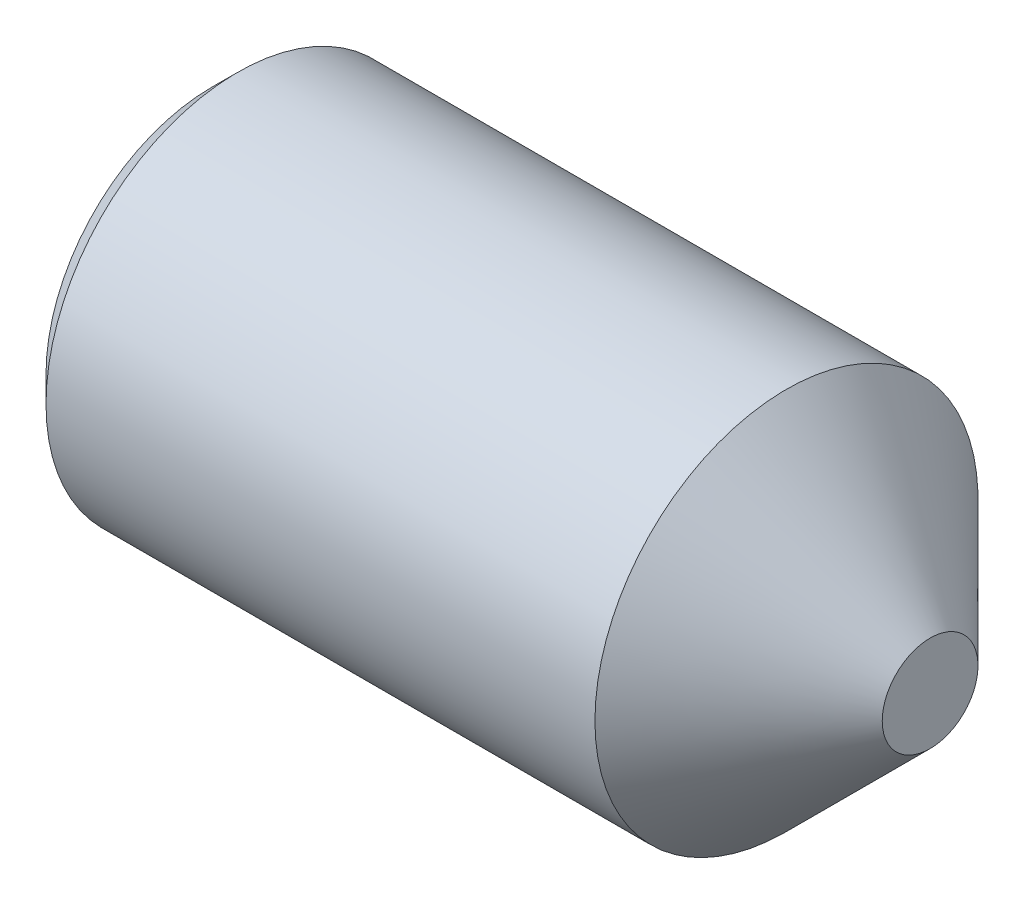
ISO-10303-21;
HEADER;
FILE_DESCRIPTION(('STEP AP214'),'2;1');
FILE_NAME('part.step','',(''),(''),'','','');
FILE_SCHEMA(('AUTOMOTIVE_DESIGN { 1 0 10303 214 1 1 1 1 }'));
ENDSEC;
DATA;
#1=APPLICATION_CONTEXT('core data for automotive mechanical design processes');
#2=APPLICATION_PROTOCOL_DEFINITION('international standard','automotive_design',2000,#1);
#3=PRODUCT_CONTEXT('',#1,'mechanical');
#4=PRODUCT('Part','Part','',(#3));
#5=PRODUCT_RELATED_PRODUCT_CATEGORY('part','',(#4));
#6=PRODUCT_DEFINITION_FORMATION('','',#4);
#7=PRODUCT_DEFINITION_CONTEXT('part definition',#1,'design');
#8=PRODUCT_DEFINITION('design','',#6,#7);
#9=PRODUCT_DEFINITION_SHAPE('','',#8);
#10=(LENGTH_UNIT() NAMED_UNIT(*) SI_UNIT(.MILLI.,.METRE.));
#11=(NAMED_UNIT(*) PLANE_ANGLE_UNIT() SI_UNIT($,.RADIAN.));
#12=(NAMED_UNIT(*) SI_UNIT($,.STERADIAN.) SOLID_ANGLE_UNIT());
#13=UNCERTAINTY_MEASURE_WITH_UNIT(LENGTH_MEASURE(1.E-05),#10,'distance_accuracy_value','');
#14=(GEOMETRIC_REPRESENTATION_CONTEXT(3) GLOBAL_UNCERTAINTY_ASSIGNED_CONTEXT((#13)) GLOBAL_UNIT_ASSIGNED_CONTEXT((#10,
#11,#12)) REPRESENTATION_CONTEXT('',''));
#15=CARTESIAN_POINT('',(0.,0.,0.));
#16=DIRECTION('',(0.,0.,1.));
#17=DIRECTION('',(1.,0.,0.));
#18=AXIS2_PLACEMENT_3D('',#15,#16,#17);
#19=CARTESIAN_POINT('',(10.,0.,4.5745));
#20=DIRECTION('',(-1.,0.,0.));
#21=DIRECTION('',(0.,0.,1.));
#22=AXIS2_PLACEMENT_3D('',#19,#20,#21);
#23=PLANE('',#22);
#24=CARTESIAN_POINT('',(10.,0.,0.));
#25=DIRECTION('',(-1.,0.,0.));
#26=DIRECTION('',(0.,0.,1.));
#27=AXIS2_PLACEMENT_3D('',#24,#25,#26);
#28=CIRCLE('',#27,3.96163320961192);
#29=CARTESIAN_POINT('',(10.,1.98081660480596,3.430875));
#30=VERTEX_POINT('',#29);
#31=CARTESIAN_POINT('',(10.,3.96163320961192,0.));
#32=VERTEX_POINT('',#31);
#33=EDGE_CURVE('E51',#30,#32,#28,.T.);
#34=ORIENTED_EDGE('',*,*,#33,.F.);
#35=DIRECTION('',(0.,0.866025403784439,-0.5));
#36=VECTOR('',#35,1.);
#37=CARTESIAN_POINT('',(10.,0.,4.5745));
#38=LINE('',#37,#36);
#39=CARTESIAN_POINT('',(10.,3.96163320961192,2.28725));
#40=VERTEX_POINT('',#39);
#41=EDGE_CURVE('E240',#30,#40,#38,.T.);
#42=ORIENTED_EDGE('',*,*,#41,.T.);
#43=DIRECTION('',(0.,0.,-1.));
#44=VECTOR('',#43,1.);
#45=CARTESIAN_POINT('',(10.,3.96163320961192,2.28725));
#46=LINE('',#45,#44);
#47=EDGE_CURVE('E233',#40,#32,#46,.T.);
#48=ORIENTED_EDGE('',*,*,#47,.T.);
#49=EDGE_LOOP('',(#34,#42,#48));
#50=FACE_BOUND('',#49,.T.);
#51=ADVANCED_FACE('F40',(#50),#23,.T.);
#52=CARTESIAN_POINT('',(10.,1.98081660480596,-3.430875));
#53=VERTEX_POINT('',#52);
#54=EDGE_CURVE('E11',#32,#53,#28,.T.);
#55=ORIENTED_EDGE('',*,*,#54,.F.);
#56=CARTESIAN_POINT('',(10.,3.96163320961192,-2.28725));
#57=VERTEX_POINT('',#56);
#58=EDGE_CURVE('E236',#32,#57,#46,.T.);
#59=ORIENTED_EDGE('',*,*,#58,.T.);
#60=DIRECTION('',(0.,-0.866025403784439,-0.5));
#61=VECTOR('',#60,1.);
#62=CARTESIAN_POINT('',(10.,3.96163320961192,-2.28725));
#63=LINE('',#62,#61);
#64=EDGE_CURVE('E229',#57,#53,#63,.T.);
#65=ORIENTED_EDGE('',*,*,#64,.T.);
#66=EDGE_LOOP('',(#55,#59,#65));
#67=FACE_BOUND('',#66,.T.);
#68=ADVANCED_FACE('F127',(#67),#23,.T.);
#69=CARTESIAN_POINT('',(10.,-1.98081660480596,-3.430875));
#70=VERTEX_POINT('',#69);
#71=EDGE_CURVE('E49',#53,#70,#28,.T.);
#72=ORIENTED_EDGE('',*,*,#71,.F.);
#73=CARTESIAN_POINT('',(10.,0.,-4.5745));
#74=VERTEX_POINT('',#73);
#75=EDGE_CURVE('E232',#53,#74,#63,.T.);
#76=ORIENTED_EDGE('',*,*,#75,.T.);
#77=DIRECTION('',(0.,-0.866025403784439,0.5));
#78=VECTOR('',#77,1.);
#79=CARTESIAN_POINT('',(10.,0.,-4.5745));
#80=LINE('',#79,#78);
#81=EDGE_CURVE('E225',#74,#70,#80,.T.);
#82=ORIENTED_EDGE('',*,*,#81,.T.);
#83=EDGE_LOOP('',(#72,#76,#82));
#84=FACE_BOUND('',#83,.T.);
#85=ADVANCED_FACE('F132',(#84),#23,.T.);
#86=CARTESIAN_POINT('',(10.,-3.96163320961192,0.));
#87=VERTEX_POINT('',#86);
#88=EDGE_CURVE('E244',#70,#87,#28,.T.);
#89=ORIENTED_EDGE('',*,*,#88,.F.);
#90=CARTESIAN_POINT('',(10.,-3.96163320961191,-2.28725));
#91=VERTEX_POINT('',#90);
#92=EDGE_CURVE('E228',#70,#91,#80,.T.);
#93=ORIENTED_EDGE('',*,*,#92,.T.);
#94=DIRECTION('',(0.,0.,1.));
#95=VECTOR('',#94,1.);
#96=CARTESIAN_POINT('',(10.,-3.96163320961191,-2.28725));
#97=LINE('',#96,#95);
#98=EDGE_CURVE('E196',#91,#87,#97,.T.);
#99=ORIENTED_EDGE('',*,*,#98,.T.);
#100=EDGE_LOOP('',(#89,#93,#99));
#101=FACE_BOUND('',#100,.T.);
#102=ADVANCED_FACE('F251',(#101),#23,.T.);
#103=CARTESIAN_POINT('',(10.,-1.98081660480596,3.430875));
#104=VERTEX_POINT('',#103);
#105=EDGE_CURVE('E58',#87,#104,#28,.T.);
#106=ORIENTED_EDGE('',*,*,#105,.F.);
#107=CARTESIAN_POINT('',(10.,-3.96163320961192,2.28725));
#108=VERTEX_POINT('',#107);
#109=EDGE_CURVE('E224',#87,#108,#97,.T.);
#110=ORIENTED_EDGE('',*,*,#109,.T.);
#111=DIRECTION('',(0.,0.866025403784439,0.5));
#112=VECTOR('',#111,1.);
#113=CARTESIAN_POINT('',(10.,-3.96163320961192,2.28725));
#114=LINE('',#113,#112);
#115=EDGE_CURVE('E241',#108,#104,#114,.T.);
#116=ORIENTED_EDGE('',*,*,#115,.T.);
#117=EDGE_LOOP('',(#106,#110,#116));
#118=FACE_BOUND('',#117,.T.);
#119=ADVANCED_FACE('F125',(#118),#23,.T.);
#120=CARTESIAN_POINT('',(0.,6.928,0.));
#121=DIRECTION('',(1.,0.,0.));
#122=DIRECTION('',(0.,0.,-1.));
#123=AXIS2_PLACEMENT_3D('',#120,#121,#122);
#124=PLANE('',#123);
#125=DIRECTION('',(0.,0.866025403784439,-0.5));
#126=VECTOR('',#125,1.);
#127=CARTESIAN_POINT('',(0.,0.,4.5745));
#128=LINE('',#127,#126);
#129=CARTESIAN_POINT('',(0.,0.,4.5745));
#130=VERTEX_POINT('',#129);
#131=CARTESIAN_POINT('',(0.,3.96163320961192,2.28725));
#132=VERTEX_POINT('',#131);
#133=EDGE_CURVE('E218',#130,#132,#128,.T.);
#134=ORIENTED_EDGE('',*,*,#133,.F.);
#135=DIRECTION('',(0.,0.866025403784439,0.5));
#136=VECTOR('',#135,1.);
#137=CARTESIAN_POINT('',(0.,-3.96163320961192,2.28725));
#138=LINE('',#137,#136);
#139=CARTESIAN_POINT('',(0.,-3.96163320961192,2.28725));
#140=VERTEX_POINT('',#139);
#141=EDGE_CURVE('E66',#140,#130,#138,.T.);
#142=ORIENTED_EDGE('',*,*,#141,.F.);
#143=DIRECTION('',(0.,0.,1.));
#144=VECTOR('',#143,1.);
#145=CARTESIAN_POINT('',(0.,-3.96163320961191,-2.28725));
#146=LINE('',#145,#144);
#147=CARTESIAN_POINT('',(0.,-3.96163320961191,-2.28725));
#148=VERTEX_POINT('',#147);
#149=EDGE_CURVE('E205',#148,#140,#146,.T.);
#150=ORIENTED_EDGE('',*,*,#149,.F.);
#151=DIRECTION('',(0.,-0.866025403784439,0.5));
#152=VECTOR('',#151,1.);
#153=CARTESIAN_POINT('',(0.,0.,-4.5745));
#154=LINE('',#153,#152);
#155=CARTESIAN_POINT('',(0.,0.,-4.5745));
#156=VERTEX_POINT('',#155);
#157=EDGE_CURVE('E209',#156,#148,#154,.T.);
#158=ORIENTED_EDGE('',*,*,#157,.F.);
#159=DIRECTION('',(0.,-0.866025403784439,-0.5));
#160=VECTOR('',#159,1.);
#161=CARTESIAN_POINT('',(0.,3.96163320961192,-2.28725));
#162=LINE('',#161,#160);
#163=CARTESIAN_POINT('',(0.,3.96163320961192,-2.28725));
#164=VERTEX_POINT('',#163);
#165=EDGE_CURVE('E212',#164,#156,#162,.T.);
#166=ORIENTED_EDGE('',*,*,#165,.F.);
#167=DIRECTION('',(0.,0.,-1.));
#168=VECTOR('',#167,1.);
#169=CARTESIAN_POINT('',(0.,3.96163320961192,2.28725));
#170=LINE('',#169,#168);
#171=EDGE_CURVE('E215',#132,#164,#170,.T.);
#172=ORIENTED_EDGE('',*,*,#171,.F.);
#173=EDGE_LOOP('',(#134,#142,#150,#158,#166,#172));
#174=FACE_BOUND('',#173,.T.);
#175=CARTESIAN_POINT('',(0.,0.,0.));
#176=DIRECTION('',(-1.,0.,0.));
#177=DIRECTION('',(0.,0.,1.));
#178=AXIS2_PLACEMENT_3D('',#175,#176,#177);
#179=CIRCLE('',#178,6.928);
#180=CARTESIAN_POINT('',(0.,0.,6.928));
#181=VERTEX_POINT('',#180);
#182=EDGE_CURVE('E44',#181,#181,#179,.T.);
#183=ORIENTED_EDGE('',*,*,#182,.T.);
#184=EDGE_LOOP('',(#183));
#185=FACE_BOUND('',#184,.T.);
#186=ADVANCED_FACE('F42',(#174,#185),#124,.F.);
#187=CARTESIAN_POINT('',(1.07200000000001,0.,0.));
#188=DIRECTION('',(1.,0.,0.));
#189=DIRECTION('',(0.,0.,-1.));
#190=AXIS2_PLACEMENT_3D('',#187,#188,#189);
#191=CONICAL_SURFACE('',#190,8.,0.785398163397443);
#192=ORIENTED_EDGE('',*,*,#182,.F.);
#193=EDGE_LOOP('',(#192));
#194=FACE_BOUND('',#193,.T.);
#195=CARTESIAN_POINT('',(1.07200000000001,0.,0.));
#196=DIRECTION('',(-1.,0.,0.));
#197=DIRECTION('',(0.,0.,1.));
#198=AXIS2_PLACEMENT_3D('',#195,#196,#197);
#199=CIRCLE('',#198,8.);
#200=CARTESIAN_POINT('',(1.07200000000001,0.,8.));
#201=VERTEX_POINT('',#200);
#202=EDGE_CURVE('E181',#201,#201,#199,.T.);
#203=ORIENTED_EDGE('',*,*,#202,.T.);
#204=EDGE_LOOP('',(#203));
#205=FACE_BOUND('',#204,.T.);
#206=ADVANCED_FACE('F168',(#194,#205),#191,.T.);
#207=CARTESIAN_POINT('',(-1.4104518001455,0.,0.));
#208=DIRECTION('',(-1.,0.,0.));
#209=DIRECTION('',(0.,0.,1.));
#210=AXIS2_PLACEMENT_3D('',#207,#208,#209);
#211=CYLINDRICAL_SURFACE('',#210,8.);
#212=ORIENTED_EDGE('',*,*,#202,.F.);
#213=EDGE_LOOP('',(#212));
#214=FACE_BOUND('',#213,.T.);
#215=CARTESIAN_POINT('',(23.9999999999999,0.,0.));
#216=DIRECTION('',(-1.,0.,0.));
#217=DIRECTION('',(0.,0.,1.));
#218=AXIS2_PLACEMENT_3D('',#215,#216,#217);
#219=CIRCLE('',#218,8.);
#220=CARTESIAN_POINT('',(23.9999999999999,0.,8.));
#221=VERTEX_POINT('',#220);
#222=EDGE_CURVE('E182',#221,#221,#219,.T.);
#223=ORIENTED_EDGE('',*,*,#222,.T.);
#224=EDGE_LOOP('',(#223));
#225=FACE_BOUND('',#224,.T.);
#226=ADVANCED_FACE('F165',(#214,#225),#211,.T.);
#227=CARTESIAN_POINT('',(30.,0.,0.));
#228=DIRECTION('',(-1.,0.,0.));
#229=DIRECTION('',(0.,0.,1.));
#230=AXIS2_PLACEMENT_3D('',#227,#228,#229);
#231=CONICAL_SURFACE('',#230,2.,0.785398163397443);
#232=CARTESIAN_POINT('',(30.,0.,0.));
#233=DIRECTION('',(-1.,0.,0.));
#234=DIRECTION('',(0.,0.,1.));
#235=AXIS2_PLACEMENT_3D('',#232,#233,#234);
#236=CIRCLE('',#235,2.);
#237=CARTESIAN_POINT('',(30.,0.,2.));
#238=VERTEX_POINT('',#237);
#239=EDGE_CURVE('E186',#238,#238,#236,.T.);
#240=CARTESIAN_POINT('',(23.9999999999999,0.,8.));
#241=CARTESIAN_POINT('',(24.0624999999999,0.,7.9375));
#242=CARTESIAN_POINT('',(24.1249999999999,0.,7.875));
#243=CARTESIAN_POINT('',(24.2499999999999,0.,7.75));
#244=CARTESIAN_POINT('',(24.3124999999999,0.,7.6875));
#245=CARTESIAN_POINT('',(24.4374999999999,0.,7.5625));
#246=CARTESIAN_POINT('',(24.4999999999999,0.,7.5));
#247=CARTESIAN_POINT('',(24.6249999999999,0.,7.375));
#248=CARTESIAN_POINT('',(24.6874999999999,0.,7.3125));
#249=CARTESIAN_POINT('',(24.8124999999999,0.,7.1875));
#250=CARTESIAN_POINT('',(24.875,0.,7.125));
#251=CARTESIAN_POINT('',(25.,0.,7.));
#252=CARTESIAN_POINT('',(25.0625,0.,6.9375));
#253=CARTESIAN_POINT('',(25.1875,0.,6.8125));
#254=CARTESIAN_POINT('',(25.25,0.,6.75));
#255=CARTESIAN_POINT('',(25.375,0.,6.625));
#256=CARTESIAN_POINT('',(25.4375,0.,6.5625));
#257=CARTESIAN_POINT('',(25.5625,0.,6.4375));
#258=CARTESIAN_POINT('',(25.625,0.,6.375));
#259=CARTESIAN_POINT('',(25.75,0.,6.25));
#260=CARTESIAN_POINT('',(25.8125,0.,6.1875));
#261=CARTESIAN_POINT('',(25.9375,0.,6.0625));
#262=CARTESIAN_POINT('',(26.,0.,6.));
#263=CARTESIAN_POINT('',(26.125,0.,5.875));
#264=CARTESIAN_POINT('',(26.1875,0.,5.8125));
#265=CARTESIAN_POINT('',(26.3125,0.,5.6875));
#266=CARTESIAN_POINT('',(26.375,0.,5.625));
#267=CARTESIAN_POINT('',(26.5,0.,5.5));
#268=CARTESIAN_POINT('',(26.5625,0.,5.4375));
#269=CARTESIAN_POINT('',(26.6875,0.,5.3125));
#270=CARTESIAN_POINT('',(26.75,0.,5.25));
#271=CARTESIAN_POINT('',(26.875,0.,5.125));
#272=CARTESIAN_POINT('',(26.9375,0.,5.0625));
#273=CARTESIAN_POINT('',(27.0625,0.,4.9375));
#274=CARTESIAN_POINT('',(27.125,0.,4.875));
#275=CARTESIAN_POINT('',(27.25,0.,4.75));
#276=CARTESIAN_POINT('',(27.3125,0.,4.6875));
#277=CARTESIAN_POINT('',(27.4375,0.,4.5625));
#278=CARTESIAN_POINT('',(27.5,0.,4.5));
#279=CARTESIAN_POINT('',(27.625,0.,4.375));
#280=CARTESIAN_POINT('',(27.6875,0.,4.3125));
#281=CARTESIAN_POINT('',(27.8125,0.,4.1875));
#282=CARTESIAN_POINT('',(27.875,0.,4.125));
#283=CARTESIAN_POINT('',(28.,0.,4.));
#284=CARTESIAN_POINT('',(28.0625,0.,3.9375));
#285=CARTESIAN_POINT('',(28.1875,0.,3.8125));
#286=CARTESIAN_POINT('',(28.25,0.,3.75));
#287=CARTESIAN_POINT('',(28.375,0.,3.625));
#288=CARTESIAN_POINT('',(28.4375,0.,3.5625));
#289=CARTESIAN_POINT('',(28.5625,0.,3.4375));
#290=CARTESIAN_POINT('',(28.625,0.,3.375));
#291=CARTESIAN_POINT('',(28.75,0.,3.25));
#292=CARTESIAN_POINT('',(28.8125,0.,3.1875));
#293=CARTESIAN_POINT('',(28.9375,0.,3.0625));
#294=CARTESIAN_POINT('',(29.,0.,3.));
#295=CARTESIAN_POINT('',(29.125,0.,2.875));
#296=CARTESIAN_POINT('',(29.1875,0.,2.8125));
#297=CARTESIAN_POINT('',(29.3125,0.,2.6875));
#298=CARTESIAN_POINT('',(29.375,0.,2.625));
#299=CARTESIAN_POINT('',(29.5,0.,2.5));
#300=CARTESIAN_POINT('',(29.5625,0.,2.4375));
#301=CARTESIAN_POINT('',(29.6875,0.,2.3125));
#302=CARTESIAN_POINT('',(29.75,0.,2.25));
#303=CARTESIAN_POINT('',(29.875,0.,2.125));
#304=CARTESIAN_POINT('',(29.9375,0.,2.0625));
#305=CARTESIAN_POINT('',(30.,0.,2.));
#306=B_SPLINE_CURVE_WITH_KNOTS('',3,(#240,#241,#242,#243,#244,#245,#246,#247,#248,#249,#250,
#251,#252,#253,#254,#255,#256,#257,#258,#259,#260,#261,#262,#263,#264,#265,#266,#267,#268,#269,
#270,#271,#272,#273,#274,#275,#276,#277,#278,#279,#280,#281,#282,#283,#284,#285,#286,#287,#288,
#289,#290,#291,#292,#293,#294,#295,#296,#297,#298,#299,#300,#301,#302,#303,#304,#305),
.UNSPECIFIED.,.F.,.F.,(4,2,2,2,2,2,2,2,2,2,2,2,2,2,2,2,2,2,2,2,2,2,2,2,2,2,2,2,2,2,2,2,4),(0.,
0.265165042944957,0.530330085889915,0.79549512883487,1.06066017177983,1.32582521472478,
1.59099025766974,1.8561553006147,2.12132034355965,2.38648538650461,2.65165042944957,
2.91681547239452,3.18198051533948,3.44714555828444,3.7123106012294,3.97747564417435,
4.24264068711931,4.50780573006427,4.77297077300922,5.03813581595418,5.30330085889913,
5.56846590184409,5.83363094478905,6.09879598773401,6.36396103067896,6.62912607362392,
6.89429111656887,7.15945615951383,7.42462120245879,7.68978624540375,7.9549512883487,
8.22011633129366,8.48528137423862),.UNSPECIFIED.);
#307=EDGE_CURVE('BSEAM161',#221,#238,#306,.T.);
#308=ORIENTED_EDGE('',*,*,#222,.F.);
#309=ORIENTED_EDGE('',*,*,#239,.T.);
#310=ORIENTED_EDGE('',*,*,#307,.T.);
#311=ORIENTED_EDGE('',*,*,#307,.F.);
#312=EDGE_LOOP('',(#308,#310,#309,#311));
#313=FACE_BOUND('',#312,.T.);
#314=ADVANCED_FACE('F161',(#313),#231,.T.);
#315=CARTESIAN_POINT('',(30.,0.,0.));
#316=DIRECTION('',(-1.,0.,0.));
#317=DIRECTION('',(0.,0.,1.));
#318=AXIS2_PLACEMENT_3D('',#315,#316,#317);
#319=PLANE('',#318);
#320=ORIENTED_EDGE('',*,*,#239,.F.);
#321=EDGE_LOOP('',(#320));
#322=FACE_BOUND('',#321,.T.);
#323=ADVANCED_FACE('F158',(#322),#319,.F.);
#324=CARTESIAN_POINT('',(10.,-3.96163320961192,2.28725));
#325=DIRECTION('',(0.,-0.5,0.866025403784439));
#326=DIRECTION('',(0.,-0.866025403784439,-0.5));
#327=AXIS2_PLACEMENT_3D('',#324,#325,#326);
#328=PLANE('',#327);
#329=ORIENTED_EDGE('',*,*,#141,.T.);
#330=DIRECTION('',(-1.,0.,0.));
#331=VECTOR('',#330,1.);
#332=CARTESIAN_POINT('',(10.,0.,4.5745));
#333=LINE('',#332,#331);
#334=CARTESIAN_POINT('',(10.,0.,4.5745));
#335=VERTEX_POINT('',#334);
#336=EDGE_CURVE('E193',#335,#130,#333,.T.);
#337=ORIENTED_EDGE('',*,*,#336,.F.);
#338=EDGE_CURVE('E208',#104,#335,#114,.T.);
#339=ORIENTED_EDGE('',*,*,#338,.F.);
#340=ORIENTED_EDGE('',*,*,#115,.F.);
#341=DIRECTION('',(-1.,0.,0.));
#342=VECTOR('',#341,1.);
#343=CARTESIAN_POINT('',(10.,-3.96163320961192,2.28725));
#344=LINE('',#343,#342);
#345=EDGE_CURVE('E192',#108,#140,#344,.T.);
#346=ORIENTED_EDGE('',*,*,#345,.T.);
#347=EDGE_LOOP('',(#329,#337,#339,#340,#346));
#348=FACE_BOUND('',#347,.T.);
#349=ADVANCED_FACE('F140',(#348),#328,.F.);
#350=CARTESIAN_POINT('',(10.,-3.96163320961191,-2.28725));
#351=DIRECTION('',(0.,-1.,0.));
#352=DIRECTION('',(0.,0.,-1.));
#353=AXIS2_PLACEMENT_3D('',#350,#351,#352);
#354=PLANE('',#353);
#355=ORIENTED_EDGE('',*,*,#149,.T.);
#356=ORIENTED_EDGE('',*,*,#345,.F.);
#357=ORIENTED_EDGE('',*,*,#109,.F.);
#358=ORIENTED_EDGE('',*,*,#98,.F.);
#359=DIRECTION('',(-1.,0.,0.));
#360=VECTOR('',#359,1.);
#361=CARTESIAN_POINT('',(10.,-3.96163320961191,-2.28725));
#362=LINE('',#361,#360);
#363=EDGE_CURVE('E202',#91,#148,#362,.T.);
#364=ORIENTED_EDGE('',*,*,#363,.T.);
#365=EDGE_LOOP('',(#355,#356,#357,#358,#364));
#366=FACE_BOUND('',#365,.T.);
#367=ADVANCED_FACE('F136',(#366),#354,.F.);
#368=CARTESIAN_POINT('',(10.,0.,-4.5745));
#369=DIRECTION('',(0.,-0.5,-0.866025403784438));
#370=DIRECTION('',(0.,0.866025403784439,-0.5));
#371=AXIS2_PLACEMENT_3D('',#368,#369,#370);
#372=PLANE('',#371);
#373=ORIENTED_EDGE('',*,*,#157,.T.);
#374=ORIENTED_EDGE('',*,*,#363,.F.);
#375=ORIENTED_EDGE('',*,*,#92,.F.);
#376=ORIENTED_EDGE('',*,*,#81,.F.);
#377=DIRECTION('',(-1.,0.,0.));
#378=VECTOR('',#377,1.);
#379=CARTESIAN_POINT('',(10.,0.,-4.5745));
#380=LINE('',#379,#378);
#381=EDGE_CURVE('E200',#74,#156,#380,.T.);
#382=ORIENTED_EDGE('',*,*,#381,.T.);
#383=EDGE_LOOP('',(#373,#374,#375,#376,#382));
#384=FACE_BOUND('',#383,.T.);
#385=ADVANCED_FACE('F139',(#384),#372,.F.);
#386=CARTESIAN_POINT('',(10.,3.96163320961192,-2.28725));
#387=DIRECTION('',(0.,0.5,-0.866025403784439));
#388=DIRECTION('',(0.,0.866025403784439,0.5));
#389=AXIS2_PLACEMENT_3D('',#386,#387,#388);
#390=PLANE('',#389);
#391=ORIENTED_EDGE('',*,*,#165,.T.);
#392=ORIENTED_EDGE('',*,*,#381,.F.);
#393=ORIENTED_EDGE('',*,*,#75,.F.);
#394=ORIENTED_EDGE('',*,*,#64,.F.);
#395=DIRECTION('',(-1.,0.,0.));
#396=VECTOR('',#395,1.);
#397=CARTESIAN_POINT('',(10.,3.96163320961192,-2.28725));
#398=LINE('',#397,#396);
#399=EDGE_CURVE('E198',#57,#164,#398,.T.);
#400=ORIENTED_EDGE('',*,*,#399,.T.);
#401=EDGE_LOOP('',(#391,#392,#393,#394,#400));
#402=FACE_BOUND('',#401,.T.);
#403=ADVANCED_FACE('F144',(#402),#390,.F.);
#404=CARTESIAN_POINT('',(10.,3.96163320961192,2.28725));
#405=DIRECTION('',(0.,1.,0.));
#406=DIRECTION('',(0.,0.,1.));
#407=AXIS2_PLACEMENT_3D('',#404,#405,#406);
#408=PLANE('',#407);
#409=ORIENTED_EDGE('',*,*,#171,.T.);
#410=ORIENTED_EDGE('',*,*,#399,.F.);
#411=ORIENTED_EDGE('',*,*,#58,.F.);
#412=ORIENTED_EDGE('',*,*,#47,.F.);
#413=DIRECTION('',(-1.,0.,0.));
#414=VECTOR('',#413,1.);
#415=CARTESIAN_POINT('',(10.,3.96163320961192,2.28725));
#416=LINE('',#415,#414);
#417=EDGE_CURVE('E195',#40,#132,#416,.T.);
#418=ORIENTED_EDGE('',*,*,#417,.T.);
#419=EDGE_LOOP('',(#409,#410,#411,#412,#418));
#420=FACE_BOUND('',#419,.T.);
#421=ADVANCED_FACE('F148',(#420),#408,.F.);
#422=CARTESIAN_POINT('',(10.,0.,4.5745));
#423=DIRECTION('',(0.,0.5,0.866025403784438));
#424=DIRECTION('',(0.,-0.866025403784439,0.5));
#425=AXIS2_PLACEMENT_3D('',#422,#423,#424);
#426=PLANE('',#425);
#427=ORIENTED_EDGE('',*,*,#133,.T.);
#428=ORIENTED_EDGE('',*,*,#417,.F.);
#429=ORIENTED_EDGE('',*,*,#41,.F.);
#430=EDGE_CURVE('E237',#335,#30,#38,.T.);
#431=ORIENTED_EDGE('',*,*,#430,.F.);
#432=ORIENTED_EDGE('',*,*,#336,.T.);
#433=EDGE_LOOP('',(#427,#428,#429,#431,#432));
#434=FACE_BOUND('',#433,.T.);
#435=ADVANCED_FACE('F122',(#434),#426,.F.);
#436=EDGE_CURVE('E184',#104,#30,#28,.T.);
#437=ORIENTED_EDGE('',*,*,#436,.F.);
#438=ORIENTED_EDGE('',*,*,#338,.T.);
#439=ORIENTED_EDGE('',*,*,#430,.T.);
#440=EDGE_LOOP('',(#437,#438,#439));
#441=FACE_BOUND('',#440,.T.);
#442=ADVANCED_FACE('F117',(#441),#23,.T.);
#443=CARTESIAN_POINT('',(12.28725,0.,0.));
#444=DIRECTION('',(-1.,0.,0.));
#445=DIRECTION('',(0.,0.,1.));
#446=AXIS2_PLACEMENT_3D('',#443,#444,#445);
#447=CONICAL_SURFACE('',#446,0.,1.04719755119659);
#448=ORIENTED_EDGE('',*,*,#33,.T.);
#449=ORIENTED_EDGE('',*,*,#54,.T.);
#450=ORIENTED_EDGE('',*,*,#71,.T.);
#451=ORIENTED_EDGE('',*,*,#88,.T.);
#452=ORIENTED_EDGE('',*,*,#105,.T.);
#453=ORIENTED_EDGE('',*,*,#436,.T.);
#454=EDGE_LOOP('',(#448,#449,#450,#451,#452,#453));
#455=FACE_BOUND('',#454,.T.);
#456=CARTESIAN_POINT('',(12.28725,0.,0.));
#457=VERTEX_POINT('',#456);
#458=VERTEX_LOOP('',#457);
#459=FACE_BOUND('',#458,.T.);
#460=ADVANCED_FACE('F115',(#455,#459),#447,.F.);
#461=CLOSED_SHELL('',(#51,#68,#85,#102,#119,#186,#206,#226,#314,#323,#349,#367,#385,#403,#421,
#435,#442,#460));
#462=MANIFOLD_SOLID_BREP('B2',#461);
#463=ADVANCED_BREP_SHAPE_REPRESENTATION('',(#18,#462),#14);
#464=SHAPE_DEFINITION_REPRESENTATION(#9,#463);
ENDSEC;
END-ISO-10303-21;
